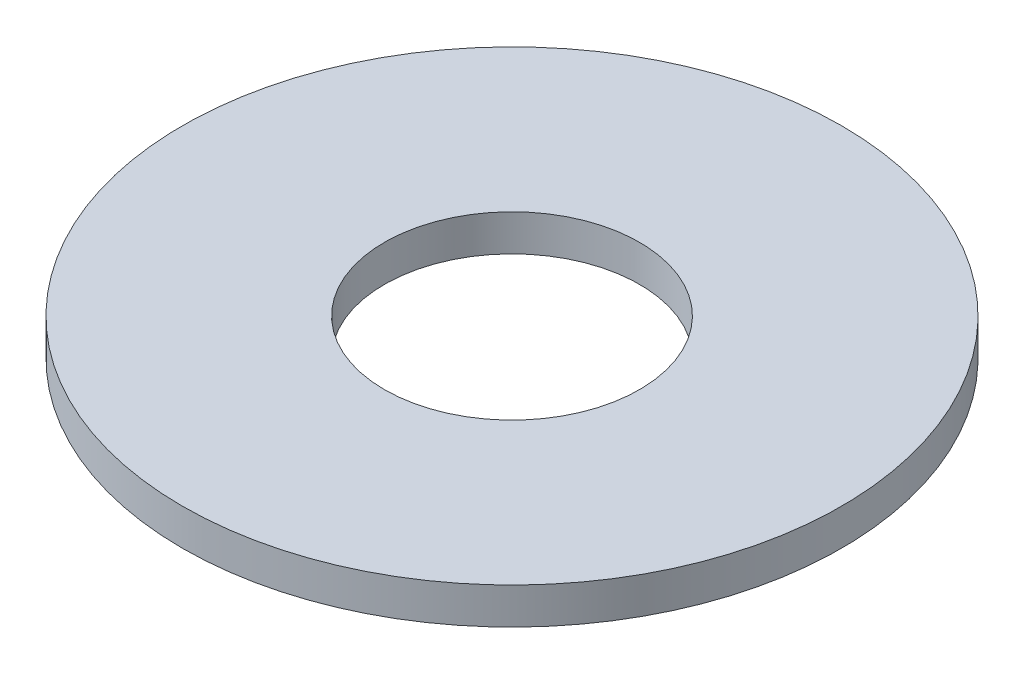
ISO-10303-21;
HEADER;
FILE_DESCRIPTION(('STEP AP214'),'2;1');
FILE_NAME('part.step','',(''),(''),'','','');
FILE_SCHEMA(('AUTOMOTIVE_DESIGN { 1 0 10303 214 1 1 1 1 }'));
ENDSEC;
DATA;
#1=APPLICATION_CONTEXT('core data for automotive mechanical design processes');
#2=APPLICATION_PROTOCOL_DEFINITION('international standard','automotive_design',2000,#1);
#3=PRODUCT_CONTEXT('',#1,'mechanical');
#4=PRODUCT('Part','Part','',(#3));
#5=PRODUCT_RELATED_PRODUCT_CATEGORY('part','',(#4));
#6=PRODUCT_DEFINITION_FORMATION('','',#4);
#7=PRODUCT_DEFINITION_CONTEXT('part definition',#1,'design');
#8=PRODUCT_DEFINITION('design','',#6,#7);
#9=PRODUCT_DEFINITION_SHAPE('','',#8);
#10=(LENGTH_UNIT() NAMED_UNIT(*) SI_UNIT(.MILLI.,.METRE.));
#11=(NAMED_UNIT(*) PLANE_ANGLE_UNIT() SI_UNIT($,.RADIAN.));
#12=(NAMED_UNIT(*) SI_UNIT($,.STERADIAN.) SOLID_ANGLE_UNIT());
#13=UNCERTAINTY_MEASURE_WITH_UNIT(LENGTH_MEASURE(1.E-05),#10,'distance_accuracy_value','');
#14=(GEOMETRIC_REPRESENTATION_CONTEXT(3) GLOBAL_UNCERTAINTY_ASSIGNED_CONTEXT((#13)) GLOBAL_UNIT_ASSIGNED_CONTEXT((#10,
#11,#12)) REPRESENTATION_CONTEXT('',''));
#15=CARTESIAN_POINT('',(0.,0.,0.));
#16=DIRECTION('',(0.,0.,1.));
#17=DIRECTION('',(1.,0.,0.));
#18=AXIS2_PLACEMENT_3D('',#15,#16,#17);
#19=CARTESIAN_POINT('',(0.,1.5875,0.));
#20=DIRECTION('',(0.,-1.,0.));
#21=DIRECTION('',(0.,0.,-1.));
#22=AXIS2_PLACEMENT_3D('',#19,#20,#21);
#23=CYLINDRICAL_SURFACE('',#22,14.351);
#24=CARTESIAN_POINT('',(0.,1.5875,0.));
#25=DIRECTION('',(0.,1.,0.));
#26=DIRECTION('',(0.,0.,1.));
#27=AXIS2_PLACEMENT_3D('',#24,#25,#26);
#28=CIRCLE('',#27,14.351);
#29=CARTESIAN_POINT('',(0.,1.5875,14.351));
#30=VERTEX_POINT('',#29);
#31=EDGE_CURVE('E10',#30,#30,#28,.T.);
#32=ORIENTED_EDGE('',*,*,#31,.F.);
#33=EDGE_LOOP('',(#32));
#34=FACE_BOUND('',#33,.T.);
#35=CARTESIAN_POINT('',(0.,0.,0.));
#36=DIRECTION('',(0.,1.,0.));
#37=DIRECTION('',(0.,0.,1.));
#38=AXIS2_PLACEMENT_3D('',#35,#36,#37);
#39=CIRCLE('',#38,14.351);
#40=CARTESIAN_POINT('',(0.,0.,14.351));
#41=VERTEX_POINT('',#40);
#42=EDGE_CURVE('E36',#41,#41,#39,.T.);
#43=ORIENTED_EDGE('',*,*,#42,.T.);
#44=EDGE_LOOP('',(#43));
#45=FACE_BOUND('',#44,.T.);
#46=ADVANCED_FACE('F33',(#34,#45),#23,.T.);
#47=CARTESIAN_POINT('',(0.,1.5875,0.));
#48=DIRECTION('',(0.,1.,0.));
#49=DIRECTION('',(0.,0.,1.));
#50=AXIS2_PLACEMENT_3D('',#47,#48,#49);
#51=PLANE('',#50);
#52=CARTESIAN_POINT('',(0.,1.5875,0.));
#53=DIRECTION('',(0.,1.,0.));
#54=DIRECTION('',(0.,0.,1.));
#55=AXIS2_PLACEMENT_3D('',#52,#53,#54);
#56=CIRCLE('',#55,5.55625);
#57=CARTESIAN_POINT('',(0.,1.5875,5.55625));
#58=VERTEX_POINT('',#57);
#59=EDGE_CURVE('E45',#58,#58,#56,.T.);
#60=ORIENTED_EDGE('',*,*,#59,.F.);
#61=EDGE_LOOP('',(#60));
#62=FACE_BOUND('',#61,.T.);
#63=ORIENTED_EDGE('',*,*,#31,.T.);
#64=EDGE_LOOP('',(#63));
#65=FACE_BOUND('',#64,.T.);
#66=ADVANCED_FACE('F60',(#62,#65),#51,.T.);
#67=CARTESIAN_POINT('',(0.,0.,0.));
#68=DIRECTION('',(0.,1.,0.));
#69=DIRECTION('',(0.,0.,1.));
#70=AXIS2_PLACEMENT_3D('',#67,#68,#69);
#71=PLANE('',#70);
#72=CARTESIAN_POINT('',(0.,0.,0.));
#73=DIRECTION('',(0.,1.,0.));
#74=DIRECTION('',(0.,0.,1.));
#75=AXIS2_PLACEMENT_3D('',#72,#73,#74);
#76=CIRCLE('',#75,5.55625);
#77=CARTESIAN_POINT('',(0.,0.,5.55625));
#78=VERTEX_POINT('',#77);
#79=EDGE_CURVE('E43',#78,#78,#76,.T.);
#80=ORIENTED_EDGE('',*,*,#79,.T.);
#81=EDGE_LOOP('',(#80));
#82=FACE_BOUND('',#81,.T.);
#83=ORIENTED_EDGE('',*,*,#42,.F.);
#84=EDGE_LOOP('',(#83));
#85=FACE_BOUND('',#84,.T.);
#86=ADVANCED_FACE('F51',(#82,#85),#71,.F.);
#87=CARTESIAN_POINT('',(0.,0.,0.));
#88=DIRECTION('',(0.,1.,0.));
#89=DIRECTION('',(0.,0.,1.));
#90=AXIS2_PLACEMENT_3D('',#87,#88,#89);
#91=CYLINDRICAL_SURFACE('',#90,5.55625);
#92=ORIENTED_EDGE('',*,*,#79,.F.);
#93=EDGE_LOOP('',(#92));
#94=FACE_BOUND('',#93,.T.);
#95=ORIENTED_EDGE('',*,*,#59,.T.);
#96=EDGE_LOOP('',(#95));
#97=FACE_BOUND('',#96,.T.);
#98=ADVANCED_FACE('F54',(#94,#97),#91,.F.);
#99=CLOSED_SHELL('',(#46,#66,#86,#98));
#100=MANIFOLD_SOLID_BREP('B2',#99);
#101=ADVANCED_BREP_SHAPE_REPRESENTATION('',(#18,#100),#14);
#102=SHAPE_DEFINITION_REPRESENTATION(#9,#101);
ENDSEC;
END-ISO-10303-21;
